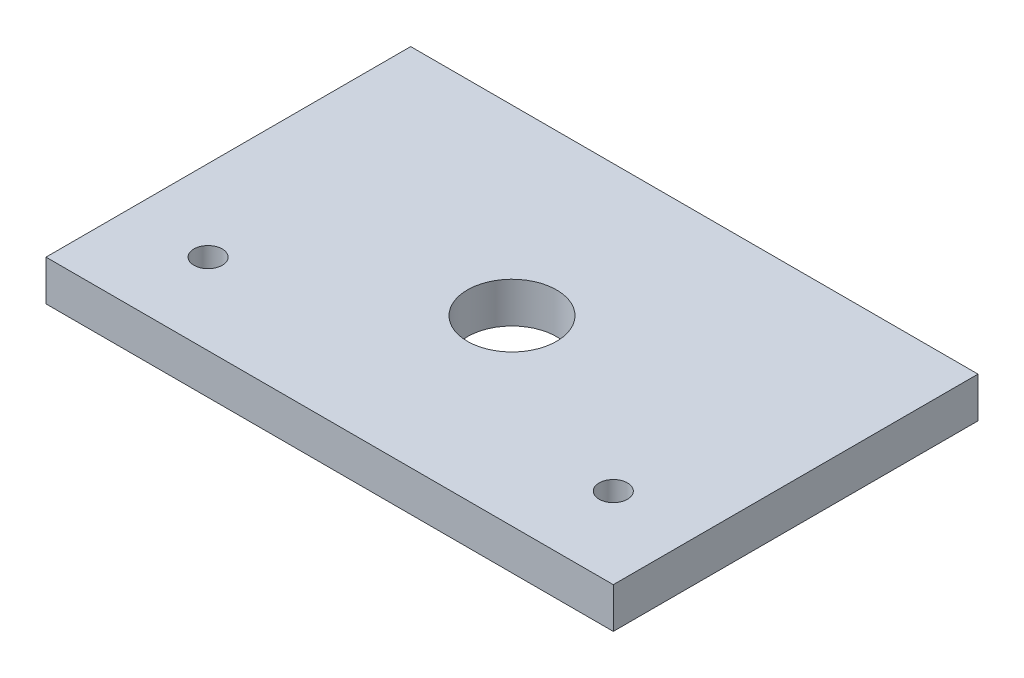
ISO-10303-21;
HEADER;
FILE_DESCRIPTION(('STEP AP214'),'2;1');
FILE_NAME('part.step','',(''),(''),'','','');
FILE_SCHEMA(('AUTOMOTIVE_DESIGN { 1 0 10303 214 1 1 1 1 }'));
ENDSEC;
DATA;
#1=APPLICATION_CONTEXT('core data for automotive mechanical design processes');
#2=APPLICATION_PROTOCOL_DEFINITION('international standard','automotive_design',2000,#1);
#3=PRODUCT_CONTEXT('',#1,'mechanical');
#4=PRODUCT('Part','Part','',(#3));
#5=PRODUCT_RELATED_PRODUCT_CATEGORY('part','',(#4));
#6=PRODUCT_DEFINITION_FORMATION('','',#4);
#7=PRODUCT_DEFINITION_CONTEXT('part definition',#1,'design');
#8=PRODUCT_DEFINITION('design','',#6,#7);
#9=PRODUCT_DEFINITION_SHAPE('','',#8);
#10=(LENGTH_UNIT() NAMED_UNIT(*) SI_UNIT(.MILLI.,.METRE.));
#11=(NAMED_UNIT(*) PLANE_ANGLE_UNIT() SI_UNIT($,.RADIAN.));
#12=(NAMED_UNIT(*) SI_UNIT($,.STERADIAN.) SOLID_ANGLE_UNIT());
#13=UNCERTAINTY_MEASURE_WITH_UNIT(LENGTH_MEASURE(1.E-05),#10,'distance_accuracy_value','');
#14=(GEOMETRIC_REPRESENTATION_CONTEXT(3) GLOBAL_UNCERTAINTY_ASSIGNED_CONTEXT((#13)) GLOBAL_UNIT_ASSIGNED_CONTEXT((#10,
#11,#12)) REPRESENTATION_CONTEXT('',''));
#15=CARTESIAN_POINT('',(0.,0.,0.));
#16=DIRECTION('',(0.,0.,1.));
#17=DIRECTION('',(1.,0.,0.));
#18=AXIS2_PLACEMENT_3D('',#15,#16,#17);
#19=CARTESIAN_POINT('',(0.,10.,0.));
#20=DIRECTION('',(0.,-1.,0.));
#21=DIRECTION('',(0.,0.,-1.));
#22=AXIS2_PLACEMENT_3D('',#19,#20,#21);
#23=PLANE('',#22);
#24=DIRECTION('',(0.,0.,-1.));
#25=VECTOR('',#24,1.);
#26=CARTESIAN_POINT('',(70.,10.,45.));
#27=LINE('',#26,#25);
#28=CARTESIAN_POINT('',(70.,10.,45.));
#29=VERTEX_POINT('',#28);
#30=CARTESIAN_POINT('',(70.,10.,-45.));
#31=VERTEX_POINT('',#30);
#32=EDGE_CURVE('E89',#29,#31,#27,.T.);
#33=ORIENTED_EDGE('',*,*,#32,.T.);
#34=DIRECTION('',(-1.,0.,0.));
#35=VECTOR('',#34,1.);
#36=CARTESIAN_POINT('',(-70.,10.,-45.));
#37=LINE('',#36,#35);
#38=CARTESIAN_POINT('',(-70.,10.,-45.));
#39=VERTEX_POINT('',#38);
#40=EDGE_CURVE('E84',#31,#39,#37,.T.);
#41=ORIENTED_EDGE('',*,*,#40,.T.);
#42=DIRECTION('',(0.,0.,1.));
#43=VECTOR('',#42,1.);
#44=CARTESIAN_POINT('',(-70.,10.,45.));
#45=LINE('',#44,#43);
#46=CARTESIAN_POINT('',(-70.,10.,45.));
#47=VERTEX_POINT('',#46);
#48=EDGE_CURVE('E87',#39,#47,#45,.T.);
#49=ORIENTED_EDGE('',*,*,#48,.T.);
#50=DIRECTION('',(1.,0.,0.));
#51=VECTOR('',#50,1.);
#52=CARTESIAN_POINT('',(-70.,10.,45.));
#53=LINE('',#52,#51);
#54=EDGE_CURVE('E54',#47,#29,#53,.T.);
#55=ORIENTED_EDGE('',*,*,#54,.T.);
#56=EDGE_LOOP('',(#33,#41,#49,#55));
#57=FACE_BOUND('',#56,.T.);
#58=CARTESIAN_POINT('',(0.,10.,0.));
#59=DIRECTION('',(0.,1.,0.));
#60=DIRECTION('',(0.,0.,1.));
#61=AXIS2_PLACEMENT_3D('',#58,#59,#60);
#62=CIRCLE('',#61,11.);
#63=CARTESIAN_POINT('',(0.,10.,11.));
#64=VERTEX_POINT('',#63);
#65=EDGE_CURVE('E104',#64,#64,#62,.T.);
#66=ORIENTED_EDGE('',*,*,#65,.F.);
#67=EDGE_LOOP('',(#66));
#68=FACE_BOUND('',#67,.T.);
#69=CARTESIAN_POINT('',(-50.,10.,25.));
#70=DIRECTION('',(0.,1.,0.));
#71=DIRECTION('',(0.,0.,1.));
#72=AXIS2_PLACEMENT_3D('',#69,#70,#71);
#73=CIRCLE('',#72,3.5);
#74=CARTESIAN_POINT('',(-50.,10.,28.5));
#75=VERTEX_POINT('',#74);
#76=EDGE_CURVE('E119',#75,#75,#73,.T.);
#77=ORIENTED_EDGE('',*,*,#76,.F.);
#78=EDGE_LOOP('',(#77));
#79=FACE_BOUND('',#78,.T.);
#80=CARTESIAN_POINT('',(50.,10.,25.));
#81=DIRECTION('',(0.,1.,0.));
#82=DIRECTION('',(0.,0.,1.));
#83=AXIS2_PLACEMENT_3D('',#80,#81,#82);
#84=CIRCLE('',#83,3.5);
#85=CARTESIAN_POINT('',(50.,10.,28.5));
#86=VERTEX_POINT('',#85);
#87=EDGE_CURVE('E125',#86,#86,#84,.T.);
#88=ORIENTED_EDGE('',*,*,#87,.F.);
#89=EDGE_LOOP('',(#88));
#90=FACE_BOUND('',#89,.T.);
#91=ADVANCED_FACE('F37',(#57,#68,#79,#90),#23,.F.);
#92=CARTESIAN_POINT('',(0.,0.,0.));
#93=DIRECTION('',(0.,-1.,0.));
#94=DIRECTION('',(0.,0.,-1.));
#95=AXIS2_PLACEMENT_3D('',#92,#93,#94);
#96=PLANE('',#95);
#97=CARTESIAN_POINT('',(-50.,0.,25.));
#98=DIRECTION('',(0.,1.,0.));
#99=DIRECTION('',(0.,0.,1.));
#100=AXIS2_PLACEMENT_3D('',#97,#98,#99);
#101=CIRCLE('',#100,3.5);
#102=CARTESIAN_POINT('',(-50.,0.,28.5));
#103=VERTEX_POINT('',#102);
#104=EDGE_CURVE('E122',#103,#103,#101,.T.);
#105=ORIENTED_EDGE('',*,*,#104,.T.);
#106=EDGE_LOOP('',(#105));
#107=FACE_BOUND('',#106,.T.);
#108=DIRECTION('',(0.,0.,-1.));
#109=VECTOR('',#108,1.);
#110=CARTESIAN_POINT('',(70.,0.,45.));
#111=LINE('',#110,#109);
#112=CARTESIAN_POINT('',(70.,0.,45.));
#113=VERTEX_POINT('',#112);
#114=CARTESIAN_POINT('',(70.,0.,-45.));
#115=VERTEX_POINT('',#114);
#116=EDGE_CURVE('E101',#113,#115,#111,.T.);
#117=ORIENTED_EDGE('',*,*,#116,.F.);
#118=DIRECTION('',(1.,0.,0.));
#119=VECTOR('',#118,1.);
#120=CARTESIAN_POINT('',(-70.,0.,45.));
#121=LINE('',#120,#119);
#122=CARTESIAN_POINT('',(-70.,0.,45.));
#123=VERTEX_POINT('',#122);
#124=EDGE_CURVE('E77',#123,#113,#121,.T.);
#125=ORIENTED_EDGE('',*,*,#124,.F.);
#126=DIRECTION('',(0.,0.,1.));
#127=VECTOR('',#126,1.);
#128=CARTESIAN_POINT('',(-70.,0.,45.));
#129=LINE('',#128,#127);
#130=CARTESIAN_POINT('',(-70.,0.,-45.));
#131=VERTEX_POINT('',#130);
#132=EDGE_CURVE('E71',#131,#123,#129,.T.);
#133=ORIENTED_EDGE('',*,*,#132,.F.);
#134=DIRECTION('',(-1.,0.,0.));
#135=VECTOR('',#134,1.);
#136=CARTESIAN_POINT('',(-70.,0.,-45.));
#137=LINE('',#136,#135);
#138=EDGE_CURVE('E93',#115,#131,#137,.T.);
#139=ORIENTED_EDGE('',*,*,#138,.F.);
#140=EDGE_LOOP('',(#117,#125,#133,#139));
#141=FACE_BOUND('',#140,.T.);
#142=CARTESIAN_POINT('',(0.,0.,0.));
#143=DIRECTION('',(0.,1.,0.));
#144=DIRECTION('',(0.,0.,1.));
#145=AXIS2_PLACEMENT_3D('',#142,#143,#144);
#146=CIRCLE('',#145,11.);
#147=CARTESIAN_POINT('',(0.,0.,11.));
#148=VERTEX_POINT('',#147);
#149=EDGE_CURVE('E116',#148,#148,#146,.T.);
#150=ORIENTED_EDGE('',*,*,#149,.T.);
#151=EDGE_LOOP('',(#150));
#152=FACE_BOUND('',#151,.T.);
#153=CARTESIAN_POINT('',(50.,0.,25.));
#154=DIRECTION('',(0.,1.,0.));
#155=DIRECTION('',(0.,0.,1.));
#156=AXIS2_PLACEMENT_3D('',#153,#154,#155);
#157=CIRCLE('',#156,3.5);
#158=CARTESIAN_POINT('',(50.,0.,28.5));
#159=VERTEX_POINT('',#158);
#160=EDGE_CURVE('E128',#159,#159,#157,.T.);
#161=ORIENTED_EDGE('',*,*,#160,.T.);
#162=EDGE_LOOP('',(#161));
#163=FACE_BOUND('',#162,.T.);
#164=ADVANCED_FACE('F112',(#107,#141,#152,#163),#96,.T.);
#165=CARTESIAN_POINT('',(70.,10.,45.));
#166=DIRECTION('',(-1.,0.,0.));
#167=DIRECTION('',(0.,0.,1.));
#168=AXIS2_PLACEMENT_3D('',#165,#166,#167);
#169=PLANE('',#168);
#170=ORIENTED_EDGE('',*,*,#116,.T.);
#171=DIRECTION('',(0.,-1.,0.));
#172=VECTOR('',#171,1.);
#173=CARTESIAN_POINT('',(70.,10.,-45.));
#174=LINE('',#173,#172);
#175=EDGE_CURVE('E11',#31,#115,#174,.T.);
#176=ORIENTED_EDGE('',*,*,#175,.F.);
#177=ORIENTED_EDGE('',*,*,#32,.F.);
#178=DIRECTION('',(0.,-1.,0.));
#179=VECTOR('',#178,1.);
#180=CARTESIAN_POINT('',(70.,10.,45.));
#181=LINE('',#180,#179);
#182=EDGE_CURVE('E97',#29,#113,#181,.T.);
#183=ORIENTED_EDGE('',*,*,#182,.T.);
#184=EDGE_LOOP('',(#170,#176,#177,#183));
#185=FACE_BOUND('',#184,.T.);
#186=ADVANCED_FACE('F39',(#185),#169,.F.);
#187=CARTESIAN_POINT('',(-70.,10.,-45.));
#188=DIRECTION('',(0.,0.,1.));
#189=DIRECTION('',(1.,0.,0.));
#190=AXIS2_PLACEMENT_3D('',#187,#188,#189);
#191=PLANE('',#190);
#192=ORIENTED_EDGE('',*,*,#138,.T.);
#193=DIRECTION('',(0.,-1.,0.));
#194=VECTOR('',#193,1.);
#195=CARTESIAN_POINT('',(-70.,10.,-45.));
#196=LINE('',#195,#194);
#197=EDGE_CURVE('E46',#39,#131,#196,.T.);
#198=ORIENTED_EDGE('',*,*,#197,.F.);
#199=ORIENTED_EDGE('',*,*,#40,.F.);
#200=ORIENTED_EDGE('',*,*,#175,.T.);
#201=EDGE_LOOP('',(#192,#198,#199,#200));
#202=FACE_BOUND('',#201,.T.);
#203=ADVANCED_FACE('F92',(#202),#191,.F.);
#204=CARTESIAN_POINT('',(-70.,10.,45.));
#205=DIRECTION('',(1.,0.,0.));
#206=DIRECTION('',(0.,0.,-1.));
#207=AXIS2_PLACEMENT_3D('',#204,#205,#206);
#208=PLANE('',#207);
#209=ORIENTED_EDGE('',*,*,#132,.T.);
#210=DIRECTION('',(0.,-1.,0.));
#211=VECTOR('',#210,1.);
#212=CARTESIAN_POINT('',(-70.,10.,45.));
#213=LINE('',#212,#211);
#214=EDGE_CURVE('E94',#47,#123,#213,.T.);
#215=ORIENTED_EDGE('',*,*,#214,.F.);
#216=ORIENTED_EDGE('',*,*,#48,.F.);
#217=ORIENTED_EDGE('',*,*,#197,.T.);
#218=EDGE_LOOP('',(#209,#215,#216,#217));
#219=FACE_BOUND('',#218,.T.);
#220=ADVANCED_FACE('F95',(#219),#208,.F.);
#221=CARTESIAN_POINT('',(-70.,10.,45.));
#222=DIRECTION('',(0.,0.,-1.));
#223=DIRECTION('',(-1.,0.,0.));
#224=AXIS2_PLACEMENT_3D('',#221,#222,#223);
#225=PLANE('',#224);
#226=ORIENTED_EDGE('',*,*,#124,.T.);
#227=ORIENTED_EDGE('',*,*,#182,.F.);
#228=ORIENTED_EDGE('',*,*,#54,.F.);
#229=ORIENTED_EDGE('',*,*,#214,.T.);
#230=EDGE_LOOP('',(#226,#227,#228,#229));
#231=FACE_BOUND('',#230,.T.);
#232=ADVANCED_FACE('F109',(#231),#225,.F.);
#233=CARTESIAN_POINT('',(0.,10.,0.));
#234=DIRECTION('',(0.,-1.,0.));
#235=DIRECTION('',(0.,0.,-1.));
#236=AXIS2_PLACEMENT_3D('',#233,#234,#235);
#237=CYLINDRICAL_SURFACE('',#236,11.);
#238=ORIENTED_EDGE('',*,*,#65,.T.);
#239=EDGE_LOOP('',(#238));
#240=FACE_BOUND('',#239,.T.);
#241=ORIENTED_EDGE('',*,*,#149,.F.);
#242=EDGE_LOOP('',(#241));
#243=FACE_BOUND('',#242,.T.);
#244=ADVANCED_FACE('F145',(#240,#243),#237,.F.);
#245=CARTESIAN_POINT('',(-50.,10.,25.));
#246=DIRECTION('',(0.,-1.,0.));
#247=DIRECTION('',(0.,0.,-1.));
#248=AXIS2_PLACEMENT_3D('',#245,#246,#247);
#249=CYLINDRICAL_SURFACE('',#248,3.5);
#250=ORIENTED_EDGE('',*,*,#76,.T.);
#251=EDGE_LOOP('',(#250));
#252=FACE_BOUND('',#251,.T.);
#253=ORIENTED_EDGE('',*,*,#104,.F.);
#254=EDGE_LOOP('',(#253));
#255=FACE_BOUND('',#254,.T.);
#256=ADVANCED_FACE('F199',(#252,#255),#249,.F.);
#257=CARTESIAN_POINT('',(50.,10.,25.));
#258=DIRECTION('',(0.,-1.,0.));
#259=DIRECTION('',(0.,0.,-1.));
#260=AXIS2_PLACEMENT_3D('',#257,#258,#259);
#261=CYLINDRICAL_SURFACE('',#260,3.5);
#262=ORIENTED_EDGE('',*,*,#87,.T.);
#263=EDGE_LOOP('',(#262));
#264=FACE_BOUND('',#263,.T.);
#265=ORIENTED_EDGE('',*,*,#160,.F.);
#266=EDGE_LOOP('',(#265));
#267=FACE_BOUND('',#266,.T.);
#268=ADVANCED_FACE('F134',(#264,#267),#261,.F.);
#269=CLOSED_SHELL('',(#91,#164,#186,#203,#220,#232,#244,#256,#268));
#270=MANIFOLD_SOLID_BREP('B2',#269);
#271=ADVANCED_BREP_SHAPE_REPRESENTATION('',(#18,#270),#14);
#272=SHAPE_DEFINITION_REPRESENTATION(#9,#271);
ENDSEC;
END-ISO-10303-21;
